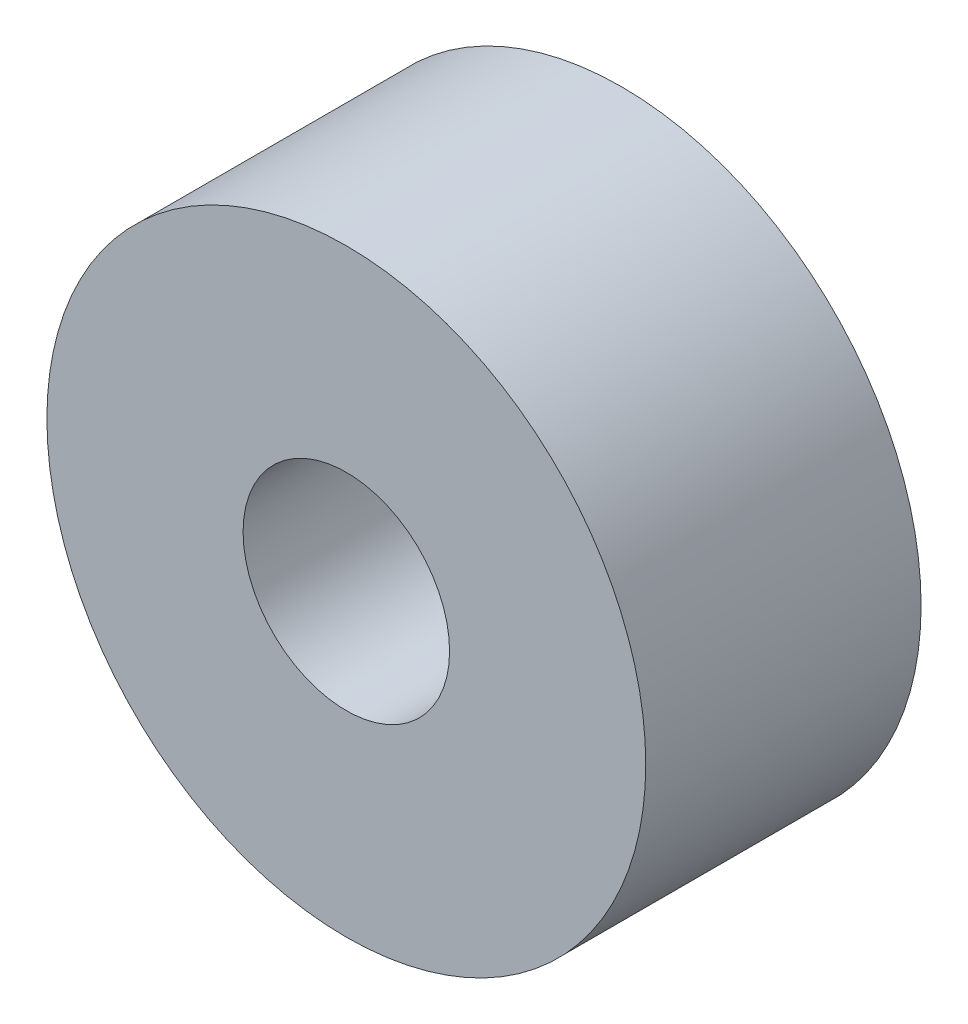
ISO-10303-21;
HEADER;
FILE_DESCRIPTION(('STEP AP214'),'2;1');
FILE_NAME('part.step','',(''),(''),'','','');
FILE_SCHEMA(('AUTOMOTIVE_DESIGN { 1 0 10303 214 1 1 1 1 }'));
ENDSEC;
DATA;
#1=APPLICATION_CONTEXT('core data for automotive mechanical design processes');
#2=APPLICATION_PROTOCOL_DEFINITION('international standard','automotive_design',2000,#1);
#3=PRODUCT_CONTEXT('',#1,'mechanical');
#4=PRODUCT('Part','Part','',(#3));
#5=PRODUCT_RELATED_PRODUCT_CATEGORY('part','',(#4));
#6=PRODUCT_DEFINITION_FORMATION('','',#4);
#7=PRODUCT_DEFINITION_CONTEXT('part definition',#1,'design');
#8=PRODUCT_DEFINITION('design','',#6,#7);
#9=PRODUCT_DEFINITION_SHAPE('','',#8);
#10=(LENGTH_UNIT() NAMED_UNIT(*) SI_UNIT(.MILLI.,.METRE.));
#11=(NAMED_UNIT(*) PLANE_ANGLE_UNIT() SI_UNIT($,.RADIAN.));
#12=(NAMED_UNIT(*) SI_UNIT($,.STERADIAN.) SOLID_ANGLE_UNIT());
#13=UNCERTAINTY_MEASURE_WITH_UNIT(LENGTH_MEASURE(1.E-05),#10,'distance_accuracy_value','');
#14=(GEOMETRIC_REPRESENTATION_CONTEXT(3) GLOBAL_UNCERTAINTY_ASSIGNED_CONTEXT((#13)) GLOBAL_UNIT_ASSIGNED_CONTEXT((#10,
#11,#12)) REPRESENTATION_CONTEXT('',''));
#15=CARTESIAN_POINT('',(0.,0.,0.));
#16=DIRECTION('',(0.,0.,1.));
#17=DIRECTION('',(1.,0.,0.));
#18=AXIS2_PLACEMENT_3D('',#15,#16,#17);
#19=CARTESIAN_POINT('',(0.,0.,4.));
#20=DIRECTION('',(0.,0.,1.));
#21=DIRECTION('',(1.,0.,0.));
#22=AXIS2_PLACEMENT_3D('',#19,#20,#21);
#23=PLANE('',#22);
#24=CARTESIAN_POINT('',(0.,0.,4.));
#25=DIRECTION('',(0.,0.,1.));
#26=DIRECTION('',(1.,0.,0.));
#27=AXIS2_PLACEMENT_3D('',#24,#25,#26);
#28=CIRCLE('',#27,4.35);
#29=CARTESIAN_POINT('',(4.35,0.,4.));
#30=VERTEX_POINT('',#29);
#31=EDGE_CURVE('E10',#30,#30,#28,.T.);
#32=ORIENTED_EDGE('',*,*,#31,.T.);
#33=EDGE_LOOP('',(#32));
#34=FACE_BOUND('',#33,.T.);
#35=CARTESIAN_POINT('',(0.,0.,4.));
#36=DIRECTION('',(0.,0.,1.));
#37=DIRECTION('',(1.,0.,0.));
#38=AXIS2_PLACEMENT_3D('',#35,#36,#37);
#39=CIRCLE('',#38,1.5);
#40=CARTESIAN_POINT('',(1.5,0.,4.));
#41=VERTEX_POINT('',#40);
#42=EDGE_CURVE('E50',#41,#41,#39,.T.);
#43=ORIENTED_EDGE('',*,*,#42,.F.);
#44=EDGE_LOOP('',(#43));
#45=FACE_BOUND('',#44,.T.);
#46=ADVANCED_FACE('F37',(#34,#45),#23,.T.);
#47=CARTESIAN_POINT('',(0.,0.,0.));
#48=DIRECTION('',(0.,0.,1.));
#49=DIRECTION('',(1.,0.,0.));
#50=AXIS2_PLACEMENT_3D('',#47,#48,#49);
#51=PLANE('',#50);
#52=CARTESIAN_POINT('',(0.,0.,0.));
#53=DIRECTION('',(0.,0.,1.));
#54=DIRECTION('',(1.,0.,0.));
#55=AXIS2_PLACEMENT_3D('',#52,#53,#54);
#56=CIRCLE('',#55,4.35);
#57=CARTESIAN_POINT('',(4.35,0.,0.));
#58=VERTEX_POINT('',#57);
#59=EDGE_CURVE('E41',#58,#58,#56,.T.);
#60=ORIENTED_EDGE('',*,*,#59,.F.);
#61=EDGE_LOOP('',(#60));
#62=FACE_BOUND('',#61,.T.);
#63=CARTESIAN_POINT('',(0.,0.,0.));
#64=DIRECTION('',(0.,0.,1.));
#65=DIRECTION('',(1.,0.,0.));
#66=AXIS2_PLACEMENT_3D('',#63,#64,#65);
#67=CIRCLE('',#66,1.5);
#68=CARTESIAN_POINT('',(1.5,0.,0.));
#69=VERTEX_POINT('',#68);
#70=EDGE_CURVE('E52',#69,#69,#67,.T.);
#71=ORIENTED_EDGE('',*,*,#70,.T.);
#72=EDGE_LOOP('',(#71));
#73=FACE_BOUND('',#72,.T.);
#74=ADVANCED_FACE('F64',(#62,#73),#51,.F.);
#75=CARTESIAN_POINT('',(0.,0.,4.));
#76=DIRECTION('',(0.,0.,-1.));
#77=DIRECTION('',(-1.,0.,0.));
#78=AXIS2_PLACEMENT_3D('',#75,#76,#77);
#79=CYLINDRICAL_SURFACE('',#78,4.35);
#80=ORIENTED_EDGE('',*,*,#31,.F.);
#81=EDGE_LOOP('',(#80));
#82=FACE_BOUND('',#81,.T.);
#83=ORIENTED_EDGE('',*,*,#59,.T.);
#84=EDGE_LOOP('',(#83));
#85=FACE_BOUND('',#84,.T.);
#86=ADVANCED_FACE('F39',(#82,#85),#79,.T.);
#87=CARTESIAN_POINT('',(0.,0.,4.));
#88=DIRECTION('',(0.,0.,-1.));
#89=DIRECTION('',(-1.,0.,0.));
#90=AXIS2_PLACEMENT_3D('',#87,#88,#89);
#91=CYLINDRICAL_SURFACE('',#90,1.5);
#92=ORIENTED_EDGE('',*,*,#42,.T.);
#93=EDGE_LOOP('',(#92));
#94=FACE_BOUND('',#93,.T.);
#95=ORIENTED_EDGE('',*,*,#70,.F.);
#96=EDGE_LOOP('',(#95));
#97=FACE_BOUND('',#96,.T.);
#98=ADVANCED_FACE('F60',(#94,#97),#91,.F.);
#99=CLOSED_SHELL('',(#46,#74,#86,#98));
#100=MANIFOLD_SOLID_BREP('B2',#99);
#101=ADVANCED_BREP_SHAPE_REPRESENTATION('',(#18,#100),#14);
#102=SHAPE_DEFINITION_REPRESENTATION(#9,#101);
ENDSEC;
END-ISO-10303-21;
